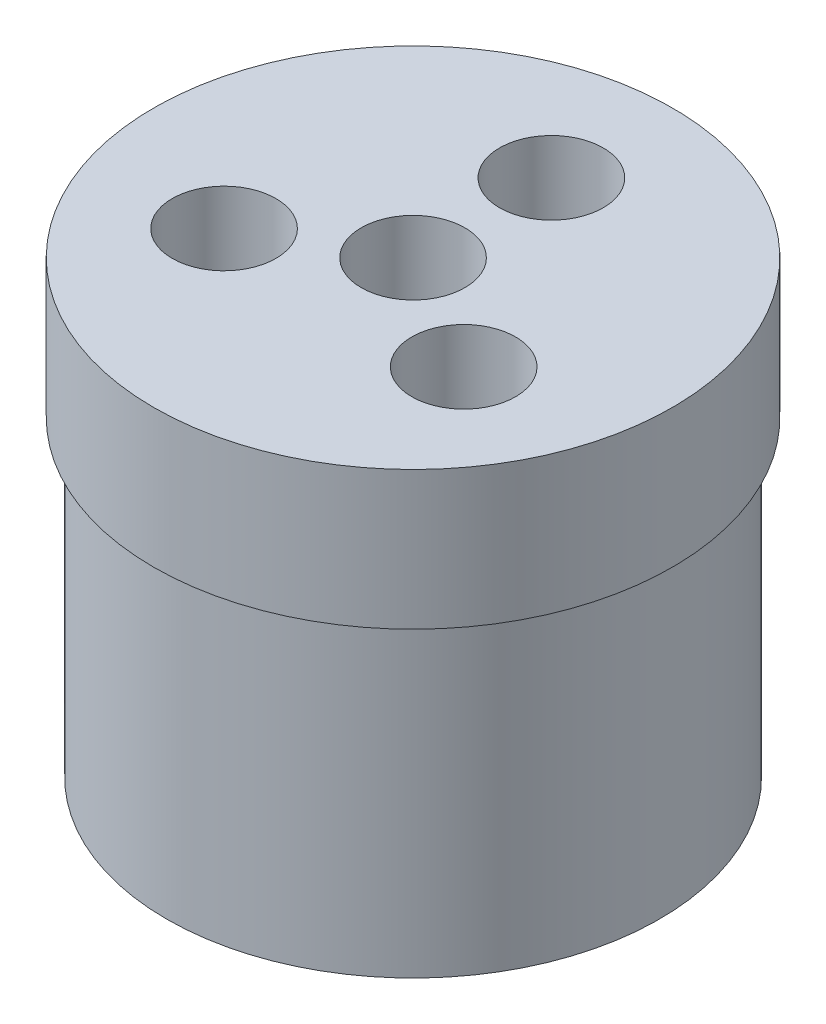
ISO-10303-21;
HEADER;
FILE_DESCRIPTION(('STEP AP214'),'2;1');
FILE_NAME('part.step','',(''),(''),'','','');
FILE_SCHEMA(('AUTOMOTIVE_DESIGN { 1 0 10303 214 1 1 1 1 }'));
ENDSEC;
DATA;
#1=APPLICATION_CONTEXT('core data for automotive mechanical design processes');
#2=APPLICATION_PROTOCOL_DEFINITION('international standard','automotive_design',2000,#1);
#3=PRODUCT_CONTEXT('',#1,'mechanical');
#4=PRODUCT('Part','Part','',(#3));
#5=PRODUCT_RELATED_PRODUCT_CATEGORY('part','',(#4));
#6=PRODUCT_DEFINITION_FORMATION('','',#4);
#7=PRODUCT_DEFINITION_CONTEXT('part definition',#1,'design');
#8=PRODUCT_DEFINITION('design','',#6,#7);
#9=PRODUCT_DEFINITION_SHAPE('','',#8);
#10=(LENGTH_UNIT() NAMED_UNIT(*) SI_UNIT(.MILLI.,.METRE.));
#11=(NAMED_UNIT(*) PLANE_ANGLE_UNIT() SI_UNIT($,.RADIAN.));
#12=(NAMED_UNIT(*) SI_UNIT($,.STERADIAN.) SOLID_ANGLE_UNIT());
#13=UNCERTAINTY_MEASURE_WITH_UNIT(LENGTH_MEASURE(1.E-05),#10,'distance_accuracy_value','');
#14=(GEOMETRIC_REPRESENTATION_CONTEXT(3) GLOBAL_UNCERTAINTY_ASSIGNED_CONTEXT((#13)) GLOBAL_UNIT_ASSIGNED_CONTEXT((#10,
#11,#12)) REPRESENTATION_CONTEXT('',''));
#15=CARTESIAN_POINT('',(0.,0.,0.));
#16=DIRECTION('',(0.,0.,1.));
#17=DIRECTION('',(1.,0.,0.));
#18=AXIS2_PLACEMENT_3D('',#15,#16,#17);
#19=CARTESIAN_POINT('',(0.,8.,0.));
#20=DIRECTION('',(0.,-1.,0.));
#21=DIRECTION('',(0.,0.,-1.));
#22=AXIS2_PLACEMENT_3D('',#19,#20,#21);
#23=CYLINDRICAL_SURFACE('',#22,15.);
#24=CARTESIAN_POINT('',(0.,8.,0.));
#25=DIRECTION('',(0.,1.,0.));
#26=DIRECTION('',(0.,0.,1.));
#27=AXIS2_PLACEMENT_3D('',#24,#25,#26);
#28=CIRCLE('',#27,15.);
#29=CARTESIAN_POINT('',(0.,8.,15.));
#30=VERTEX_POINT('',#29);
#31=EDGE_CURVE('E10',#30,#30,#28,.T.);
#32=ORIENTED_EDGE('',*,*,#31,.F.);
#33=EDGE_LOOP('',(#32));
#34=FACE_BOUND('',#33,.T.);
#35=CARTESIAN_POINT('',(0.,0.,0.));
#36=DIRECTION('',(0.,1.,0.));
#37=DIRECTION('',(0.,0.,1.));
#38=AXIS2_PLACEMENT_3D('',#35,#36,#37);
#39=CIRCLE('',#38,15.);
#40=CARTESIAN_POINT('',(0.,0.,15.));
#41=VERTEX_POINT('',#40);
#42=EDGE_CURVE('E34',#41,#41,#39,.T.);
#43=ORIENTED_EDGE('',*,*,#42,.T.);
#44=EDGE_LOOP('',(#43));
#45=FACE_BOUND('',#44,.T.);
#46=ADVANCED_FACE('F31',(#34,#45),#23,.T.);
#47=CARTESIAN_POINT('',(0.,8.,0.));
#48=DIRECTION('',(0.,1.,0.));
#49=DIRECTION('',(0.,0.,1.));
#50=AXIS2_PLACEMENT_3D('',#47,#48,#49);
#51=PLANE('',#50);
#52=CARTESIAN_POINT('',(-6.928203230275,8.,4.0000000000003));
#53=DIRECTION('',(0.,1.,0.));
#54=DIRECTION('',(0.,0.,1.));
#55=AXIS2_PLACEMENT_3D('',#52,#53,#54);
#56=CIRCLE('',#55,3.00000000000065);
#57=CARTESIAN_POINT('',(-6.928203230275,8.,7.00000000000095));
#58=VERTEX_POINT('',#57);
#59=EDGE_CURVE('E58',#58,#58,#56,.T.);
#60=ORIENTED_EDGE('',*,*,#59,.F.);
#61=EDGE_LOOP('',(#60));
#62=FACE_BOUND('',#61,.T.);
#63=CARTESIAN_POINT('',(6.92820323027602,8.,3.99999999999971));
#64=DIRECTION('',(0.,1.,0.));
#65=DIRECTION('',(0.,0.,1.));
#66=AXIS2_PLACEMENT_3D('',#63,#64,#65);
#67=CIRCLE('',#66,3.00000000000044);
#68=CARTESIAN_POINT('',(6.92820323027602,8.,7.00000000000014));
#69=VERTEX_POINT('',#68);
#70=EDGE_CURVE('E64',#69,#69,#67,.T.);
#71=ORIENTED_EDGE('',*,*,#70,.F.);
#72=EDGE_LOOP('',(#71));
#73=FACE_BOUND('',#72,.T.);
#74=CARTESIAN_POINT('',(0.,8.,-8.));
#75=DIRECTION('',(0.,1.,0.));
#76=DIRECTION('',(0.,0.,1.));
#77=AXIS2_PLACEMENT_3D('',#74,#75,#76);
#78=CIRCLE('',#77,3.);
#79=CARTESIAN_POINT('',(0.,8.,-5.));
#80=VERTEX_POINT('',#79);
#81=EDGE_CURVE('E52',#80,#80,#78,.T.);
#82=ORIENTED_EDGE('',*,*,#81,.F.);
#83=EDGE_LOOP('',(#82));
#84=FACE_BOUND('',#83,.T.);
#85=CARTESIAN_POINT('',(0.,8.,0.));
#86=DIRECTION('',(0.,1.,0.));
#87=DIRECTION('',(0.,0.,1.));
#88=AXIS2_PLACEMENT_3D('',#85,#86,#87);
#89=CIRCLE('',#88,3.);
#90=CARTESIAN_POINT('',(0.,8.,3.));
#91=VERTEX_POINT('',#90);
#92=EDGE_CURVE('E49',#91,#91,#89,.T.);
#93=ORIENTED_EDGE('',*,*,#92,.F.);
#94=EDGE_LOOP('',(#93));
#95=FACE_BOUND('',#94,.T.);
#96=ORIENTED_EDGE('',*,*,#31,.T.);
#97=EDGE_LOOP('',(#96));
#98=FACE_BOUND('',#97,.T.);
#99=ADVANCED_FACE('F75',(#62,#73,#84,#95,#98),#51,.T.);
#100=CARTESIAN_POINT('',(0.,0.,0.));
#101=DIRECTION('',(0.,1.,0.));
#102=DIRECTION('',(0.,0.,1.));
#103=AXIS2_PLACEMENT_3D('',#100,#101,#102);
#104=PLANE('',#103);
#105=CARTESIAN_POINT('',(0.,0.,0.));
#106=DIRECTION('',(0.,1.,0.));
#107=DIRECTION('',(0.,0.,1.));
#108=AXIS2_PLACEMENT_3D('',#105,#106,#107);
#109=CIRCLE('',#108,14.25);
#110=CARTESIAN_POINT('',(0.,0.,14.25));
#111=VERTEX_POINT('',#110);
#112=EDGE_CURVE('E43',#111,#111,#109,.T.);
#113=ORIENTED_EDGE('',*,*,#112,.T.);
#114=EDGE_LOOP('',(#113));
#115=FACE_BOUND('',#114,.T.);
#116=ORIENTED_EDGE('',*,*,#42,.F.);
#117=EDGE_LOOP('',(#116));
#118=FACE_BOUND('',#117,.T.);
#119=ADVANCED_FACE('F78',(#115,#118),#104,.F.);
#120=CARTESIAN_POINT('',(0.,-18.,0.));
#121=DIRECTION('',(0.,1.,0.));
#122=DIRECTION('',(0.,0.,1.));
#123=AXIS2_PLACEMENT_3D('',#120,#121,#122);
#124=CYLINDRICAL_SURFACE('',#123,14.25);
#125=CARTESIAN_POINT('',(0.,-18.,0.));
#126=DIRECTION('',(0.,1.,0.));
#127=DIRECTION('',(0.,0.,1.));
#128=AXIS2_PLACEMENT_3D('',#125,#126,#127);
#129=CIRCLE('',#128,14.25);
#130=CARTESIAN_POINT('',(0.,-18.,14.25));
#131=VERTEX_POINT('',#130);
#132=EDGE_CURVE('E41',#131,#131,#129,.T.);
#133=ORIENTED_EDGE('',*,*,#132,.T.);
#134=EDGE_LOOP('',(#133));
#135=FACE_BOUND('',#134,.T.);
#136=ORIENTED_EDGE('',*,*,#112,.F.);
#137=EDGE_LOOP('',(#136));
#138=FACE_BOUND('',#137,.T.);
#139=ADVANCED_FACE('F95',(#135,#138),#124,.T.);
#140=CARTESIAN_POINT('',(0.,-18.,0.));
#141=DIRECTION('',(0.,1.,0.));
#142=DIRECTION('',(0.,0.,1.));
#143=AXIS2_PLACEMENT_3D('',#140,#141,#142);
#144=PLANE('',#143);
#145=CARTESIAN_POINT('',(-6.928203230275,-18.,4.0000000000003));
#146=DIRECTION('',(0.,1.,0.));
#147=DIRECTION('',(0.,0.,1.));
#148=AXIS2_PLACEMENT_3D('',#145,#146,#147);
#149=CIRCLE('',#148,3.00000000000065);
#150=CARTESIAN_POINT('',(-6.928203230275,-18.,7.00000000000095));
#151=VERTEX_POINT('',#150);
#152=EDGE_CURVE('E55',#151,#151,#149,.T.);
#153=ORIENTED_EDGE('',*,*,#152,.T.);
#154=EDGE_LOOP('',(#153));
#155=FACE_BOUND('',#154,.T.);
#156=CARTESIAN_POINT('',(6.92820323027602,-18.,3.99999999999971));
#157=DIRECTION('',(0.,1.,0.));
#158=DIRECTION('',(0.,0.,1.));
#159=AXIS2_PLACEMENT_3D('',#156,#157,#158);
#160=CIRCLE('',#159,3.00000000000044);
#161=CARTESIAN_POINT('',(6.92820323027602,-18.,7.00000000000014));
#162=VERTEX_POINT('',#161);
#163=EDGE_CURVE('E61',#162,#162,#160,.T.);
#164=ORIENTED_EDGE('',*,*,#163,.T.);
#165=EDGE_LOOP('',(#164));
#166=FACE_BOUND('',#165,.T.);
#167=CARTESIAN_POINT('',(0.,-18.,-8.));
#168=DIRECTION('',(0.,1.,0.));
#169=DIRECTION('',(0.,0.,1.));
#170=AXIS2_PLACEMENT_3D('',#167,#168,#169);
#171=CIRCLE('',#170,3.);
#172=CARTESIAN_POINT('',(0.,-18.,-5.));
#173=VERTEX_POINT('',#172);
#174=EDGE_CURVE('E67',#173,#173,#171,.T.);
#175=ORIENTED_EDGE('',*,*,#174,.T.);
#176=EDGE_LOOP('',(#175));
#177=FACE_BOUND('',#176,.T.);
#178=CARTESIAN_POINT('',(0.,-18.,0.));
#179=DIRECTION('',(0.,1.,0.));
#180=DIRECTION('',(0.,0.,1.));
#181=AXIS2_PLACEMENT_3D('',#178,#179,#180);
#182=CIRCLE('',#181,3.);
#183=CARTESIAN_POINT('',(0.,-18.,3.));
#184=VERTEX_POINT('',#183);
#185=EDGE_CURVE('E46',#184,#184,#182,.T.);
#186=ORIENTED_EDGE('',*,*,#185,.T.);
#187=EDGE_LOOP('',(#186));
#188=FACE_BOUND('',#187,.T.);
#189=ORIENTED_EDGE('',*,*,#132,.F.);
#190=EDGE_LOOP('',(#189));
#191=FACE_BOUND('',#190,.T.);
#192=ADVANCED_FACE('F85',(#155,#166,#177,#188,#191),#144,.F.);
#193=CARTESIAN_POINT('',(0.,-18.,0.));
#194=DIRECTION('',(0.,1.,0.));
#195=DIRECTION('',(0.,0.,1.));
#196=AXIS2_PLACEMENT_3D('',#193,#194,#195);
#197=CYLINDRICAL_SURFACE('',#196,3.);
#198=CARTESIAN_POINT('',(0.,-18.,3.));
#199=CARTESIAN_POINT('',(0.,-17.7291666666667,3.));
#200=CARTESIAN_POINT('',(0.,-17.4583333333333,3.));
#201=CARTESIAN_POINT('',(0.,-16.9166666666667,3.));
#202=CARTESIAN_POINT('',(0.,-16.6458333333333,3.));
#203=CARTESIAN_POINT('',(0.,-16.1041666666667,3.));
#204=CARTESIAN_POINT('',(0.,-15.8333333333333,3.));
#205=CARTESIAN_POINT('',(0.,-15.2916666666667,3.));
#206=CARTESIAN_POINT('',(0.,-15.0208333333333,3.));
#207=CARTESIAN_POINT('',(0.,-14.4791666666667,3.));
#208=CARTESIAN_POINT('',(0.,-14.2083333333333,3.));
#209=CARTESIAN_POINT('',(0.,-13.6666666666667,3.));
#210=CARTESIAN_POINT('',(0.,-13.3958333333333,3.));
#211=CARTESIAN_POINT('',(0.,-12.8541666666667,3.));
#212=CARTESIAN_POINT('',(0.,-12.5833333333333,3.));
#213=CARTESIAN_POINT('',(0.,-12.0416666666667,3.));
#214=CARTESIAN_POINT('',(0.,-11.7708333333333,3.));
#215=CARTESIAN_POINT('',(0.,-11.2291666666667,3.));
#216=CARTESIAN_POINT('',(0.,-10.9583333333333,3.));
#217=CARTESIAN_POINT('',(0.,-10.4166666666667,3.));
#218=CARTESIAN_POINT('',(0.,-10.1458333333333,3.));
#219=CARTESIAN_POINT('',(0.,-9.60416666666667,3.));
#220=CARTESIAN_POINT('',(0.,-9.33333333333333,3.));
#221=CARTESIAN_POINT('',(0.,-8.79166666666667,3.));
#222=CARTESIAN_POINT('',(0.,-8.52083333333333,3.));
#223=CARTESIAN_POINT('',(0.,-7.97916666666667,3.));
#224=CARTESIAN_POINT('',(0.,-7.70833333333333,3.));
#225=CARTESIAN_POINT('',(0.,-7.16666666666667,3.));
#226=CARTESIAN_POINT('',(0.,-6.89583333333333,3.));
#227=CARTESIAN_POINT('',(0.,-6.35416666666667,3.));
#228=CARTESIAN_POINT('',(0.,-6.08333333333333,3.));
#229=CARTESIAN_POINT('',(0.,-5.54166666666667,3.));
#230=CARTESIAN_POINT('',(0.,-5.27083333333333,3.));
#231=CARTESIAN_POINT('',(0.,-4.72916666666667,3.));
#232=CARTESIAN_POINT('',(0.,-4.45833333333333,3.));
#233=CARTESIAN_POINT('',(0.,-3.91666666666667,3.));
#234=CARTESIAN_POINT('',(0.,-3.64583333333333,3.));
#235=CARTESIAN_POINT('',(0.,-3.10416666666667,3.));
#236=CARTESIAN_POINT('',(0.,-2.83333333333333,3.));
#237=CARTESIAN_POINT('',(0.,-2.29166666666667,3.));
#238=CARTESIAN_POINT('',(0.,-2.02083333333333,3.));
#239=CARTESIAN_POINT('',(0.,-1.47916666666667,3.));
#240=CARTESIAN_POINT('',(0.,-1.20833333333333,3.));
#241=CARTESIAN_POINT('',(0.,-0.666666666666667,3.));
#242=CARTESIAN_POINT('',(0.,-0.395833333333334,3.));
#243=CARTESIAN_POINT('',(0.,0.145833333333332,3.));
#244=CARTESIAN_POINT('',(0.,0.416666666666665,3.));
#245=CARTESIAN_POINT('',(0.,0.958333333333331,3.));
#246=CARTESIAN_POINT('',(0.,1.22916666666666,3.));
#247=CARTESIAN_POINT('',(0.,1.77083333333333,3.));
#248=CARTESIAN_POINT('',(0.,2.04166666666667,3.));
#249=CARTESIAN_POINT('',(0.,2.58333333333333,3.));
#250=CARTESIAN_POINT('',(0.,2.85416666666667,3.));
#251=CARTESIAN_POINT('',(0.,3.39583333333333,3.));
#252=CARTESIAN_POINT('',(0.,3.66666666666667,3.));
#253=CARTESIAN_POINT('',(0.,4.20833333333333,3.));
#254=CARTESIAN_POINT('',(0.,4.47916666666667,3.));
#255=CARTESIAN_POINT('',(0.,5.02083333333333,3.));
#256=CARTESIAN_POINT('',(0.,5.29166666666667,3.));
#257=CARTESIAN_POINT('',(0.,5.83333333333333,3.));
#258=CARTESIAN_POINT('',(0.,6.10416666666667,3.));
#259=CARTESIAN_POINT('',(0.,6.64583333333333,3.));
#260=CARTESIAN_POINT('',(0.,6.91666666666667,3.));
#261=CARTESIAN_POINT('',(0.,7.45833333333333,3.));
#262=CARTESIAN_POINT('',(0.,7.72916666666667,3.));
#263=CARTESIAN_POINT('',(0.,8.,3.));
#264=B_SPLINE_CURVE_WITH_KNOTS('',3,(#198,#199,#200,#201,#202,#203,#204,#205,#206,#207,#208,
#209,#210,#211,#212,#213,#214,#215,#216,#217,#218,#219,#220,#221,#222,#223,#224,#225,#226,#227,
#228,#229,#230,#231,#232,#233,#234,#235,#236,#237,#238,#239,#240,#241,#242,#243,#244,#245,#246,
#247,#248,#249,#250,#251,#252,#253,#254,#255,#256,#257,#258,#259,#260,#261,#262,#263),
.UNSPECIFIED.,.F.,.F.,(4,2,2,2,2,2,2,2,2,2,2,2,2,2,2,2,2,2,2,2,2,2,2,2,2,2,2,2,2,2,2,2,4),(0.,
0.812500000000001,1.625,2.4375,3.25,4.0625,4.875,5.6875,6.5,7.3125,8.125,8.9375,9.75,10.5625,
11.375,12.1875,13.,13.8125,14.625,15.4375,16.25,17.0625,17.875,18.6875,19.5,20.3125,21.125,
21.9375,22.75,23.5625,24.375,25.1875,26.),.UNSPECIFIED.);
#265=EDGE_CURVE('BSEAM83',#184,#91,#264,.T.);
#266=ORIENTED_EDGE('',*,*,#185,.F.);
#267=ORIENTED_EDGE('',*,*,#92,.T.);
#268=ORIENTED_EDGE('',*,*,#265,.T.);
#269=ORIENTED_EDGE('',*,*,#265,.F.);
#270=EDGE_LOOP('',(#266,#268,#267,#269));
#271=FACE_BOUND('',#270,.T.);
#272=ADVANCED_FACE('F83',(#271),#197,.F.);
#273=CARTESIAN_POINT('',(0.,-18.,-8.));
#274=DIRECTION('',(0.,1.,0.));
#275=DIRECTION('',(0.,0.,1.));
#276=AXIS2_PLACEMENT_3D('',#273,#274,#275);
#277=CYLINDRICAL_SURFACE('',#276,3.);
#278=CARTESIAN_POINT('',(0.,-18.,-5.));
#279=CARTESIAN_POINT('',(0.,-17.7291666666667,-5.));
#280=CARTESIAN_POINT('',(0.,-17.4583333333333,-5.));
#281=CARTESIAN_POINT('',(0.,-16.9166666666667,-5.));
#282=CARTESIAN_POINT('',(0.,-16.6458333333333,-5.));
#283=CARTESIAN_POINT('',(0.,-16.1041666666667,-5.));
#284=CARTESIAN_POINT('',(0.,-15.8333333333333,-5.));
#285=CARTESIAN_POINT('',(0.,-15.2916666666667,-5.));
#286=CARTESIAN_POINT('',(0.,-15.0208333333333,-5.));
#287=CARTESIAN_POINT('',(0.,-14.4791666666667,-5.));
#288=CARTESIAN_POINT('',(0.,-14.2083333333333,-5.));
#289=CARTESIAN_POINT('',(0.,-13.6666666666667,-5.));
#290=CARTESIAN_POINT('',(0.,-13.3958333333333,-5.));
#291=CARTESIAN_POINT('',(0.,-12.8541666666667,-5.));
#292=CARTESIAN_POINT('',(0.,-12.5833333333333,-5.));
#293=CARTESIAN_POINT('',(0.,-12.0416666666667,-5.));
#294=CARTESIAN_POINT('',(0.,-11.7708333333333,-5.));
#295=CARTESIAN_POINT('',(0.,-11.2291666666667,-5.));
#296=CARTESIAN_POINT('',(0.,-10.9583333333333,-5.));
#297=CARTESIAN_POINT('',(0.,-10.4166666666667,-5.));
#298=CARTESIAN_POINT('',(0.,-10.1458333333333,-5.));
#299=CARTESIAN_POINT('',(0.,-9.60416666666667,-5.));
#300=CARTESIAN_POINT('',(0.,-9.33333333333333,-5.));
#301=CARTESIAN_POINT('',(0.,-8.79166666666667,-5.));
#302=CARTESIAN_POINT('',(0.,-8.52083333333333,-5.));
#303=CARTESIAN_POINT('',(0.,-7.97916666666667,-5.));
#304=CARTESIAN_POINT('',(0.,-7.70833333333333,-5.));
#305=CARTESIAN_POINT('',(0.,-7.16666666666667,-5.));
#306=CARTESIAN_POINT('',(0.,-6.89583333333333,-5.));
#307=CARTESIAN_POINT('',(0.,-6.35416666666667,-5.));
#308=CARTESIAN_POINT('',(0.,-6.08333333333333,-5.));
#309=CARTESIAN_POINT('',(0.,-5.54166666666667,-5.));
#310=CARTESIAN_POINT('',(0.,-5.27083333333333,-5.));
#311=CARTESIAN_POINT('',(0.,-4.72916666666667,-5.));
#312=CARTESIAN_POINT('',(0.,-4.45833333333333,-5.));
#313=CARTESIAN_POINT('',(0.,-3.91666666666667,-5.));
#314=CARTESIAN_POINT('',(0.,-3.64583333333333,-5.));
#315=CARTESIAN_POINT('',(0.,-3.10416666666667,-5.));
#316=CARTESIAN_POINT('',(0.,-2.83333333333333,-5.));
#317=CARTESIAN_POINT('',(0.,-2.29166666666667,-5.));
#318=CARTESIAN_POINT('',(0.,-2.02083333333333,-5.));
#319=CARTESIAN_POINT('',(0.,-1.47916666666667,-5.));
#320=CARTESIAN_POINT('',(0.,-1.20833333333333,-5.));
#321=CARTESIAN_POINT('',(0.,-0.666666666666667,-5.));
#322=CARTESIAN_POINT('',(0.,-0.395833333333334,-5.));
#323=CARTESIAN_POINT('',(0.,0.145833333333332,-5.));
#324=CARTESIAN_POINT('',(0.,0.416666666666665,-5.));
#325=CARTESIAN_POINT('',(0.,0.958333333333331,-5.));
#326=CARTESIAN_POINT('',(0.,1.22916666666666,-5.));
#327=CARTESIAN_POINT('',(0.,1.77083333333333,-5.));
#328=CARTESIAN_POINT('',(0.,2.04166666666667,-5.));
#329=CARTESIAN_POINT('',(0.,2.58333333333333,-5.));
#330=CARTESIAN_POINT('',(0.,2.85416666666667,-5.));
#331=CARTESIAN_POINT('',(0.,3.39583333333333,-5.));
#332=CARTESIAN_POINT('',(0.,3.66666666666667,-5.));
#333=CARTESIAN_POINT('',(0.,4.20833333333333,-5.));
#334=CARTESIAN_POINT('',(0.,4.47916666666667,-5.));
#335=CARTESIAN_POINT('',(0.,5.02083333333333,-5.));
#336=CARTESIAN_POINT('',(0.,5.29166666666667,-5.));
#337=CARTESIAN_POINT('',(0.,5.83333333333333,-5.));
#338=CARTESIAN_POINT('',(0.,6.10416666666667,-5.));
#339=CARTESIAN_POINT('',(0.,6.64583333333333,-5.));
#340=CARTESIAN_POINT('',(0.,6.91666666666667,-5.));
#341=CARTESIAN_POINT('',(0.,7.45833333333333,-5.));
#342=CARTESIAN_POINT('',(0.,7.72916666666667,-5.));
#343=CARTESIAN_POINT('',(0.,8.,-5.));
#344=B_SPLINE_CURVE_WITH_KNOTS('',3,(#278,#279,#280,#281,#282,#283,#284,#285,#286,#287,#288,
#289,#290,#291,#292,#293,#294,#295,#296,#297,#298,#299,#300,#301,#302,#303,#304,#305,#306,#307,
#308,#309,#310,#311,#312,#313,#314,#315,#316,#317,#318,#319,#320,#321,#322,#323,#324,#325,#326,
#327,#328,#329,#330,#331,#332,#333,#334,#335,#336,#337,#338,#339,#340,#341,#342,#343),
.UNSPECIFIED.,.F.,.F.,(4,2,2,2,2,2,2,2,2,2,2,2,2,2,2,2,2,2,2,2,2,2,2,2,2,2,2,2,2,2,2,2,4),(0.,
0.812500000000001,1.625,2.4375,3.25,4.0625,4.875,5.6875,6.5,7.3125,8.125,8.9375,9.75,10.5625,
11.375,12.1875,13.,13.8125,14.625,15.4375,16.25,17.0625,17.875,18.6875,19.5,20.3125,21.125,
21.9375,22.75,23.5625,24.375,25.1875,26.),.UNSPECIFIED.);
#345=EDGE_CURVE('BSEAM73',#173,#80,#344,.T.);
#346=ORIENTED_EDGE('',*,*,#174,.F.);
#347=ORIENTED_EDGE('',*,*,#81,.T.);
#348=ORIENTED_EDGE('',*,*,#345,.T.);
#349=ORIENTED_EDGE('',*,*,#345,.F.);
#350=EDGE_LOOP('',(#346,#348,#347,#349));
#351=FACE_BOUND('',#350,.T.);
#352=ADVANCED_FACE('F73',(#351),#277,.F.);
#353=CARTESIAN_POINT('',(6.92820323027602,-18.,3.99999999999971));
#354=DIRECTION('',(0.,1.,0.));
#355=DIRECTION('',(0.,0.,1.));
#356=AXIS2_PLACEMENT_3D('',#353,#354,#355);
#357=CYLINDRICAL_SURFACE('',#356,3.00000000000044);
#358=CARTESIAN_POINT('',(6.92820323027602,-18.,7.00000000000014));
#359=CARTESIAN_POINT('',(6.92820323027602,-17.7291666666667,7.00000000000014));
#360=CARTESIAN_POINT('',(6.92820323027602,-17.4583333333333,7.00000000000014));
#361=CARTESIAN_POINT('',(6.92820323027602,-16.9166666666667,7.00000000000014));
#362=CARTESIAN_POINT('',(6.92820323027602,-16.6458333333333,7.00000000000014));
#363=CARTESIAN_POINT('',(6.92820323027602,-16.1041666666667,7.00000000000014));
#364=CARTESIAN_POINT('',(6.92820323027602,-15.8333333333333,7.00000000000014));
#365=CARTESIAN_POINT('',(6.92820323027602,-15.2916666666667,7.00000000000014));
#366=CARTESIAN_POINT('',(6.92820323027602,-15.0208333333333,7.00000000000014));
#367=CARTESIAN_POINT('',(6.92820323027602,-14.4791666666667,7.00000000000014));
#368=CARTESIAN_POINT('',(6.92820323027602,-14.2083333333333,7.00000000000014));
#369=CARTESIAN_POINT('',(6.92820323027602,-13.6666666666667,7.00000000000014));
#370=CARTESIAN_POINT('',(6.92820323027602,-13.3958333333333,7.00000000000014));
#371=CARTESIAN_POINT('',(6.92820323027602,-12.8541666666667,7.00000000000014));
#372=CARTESIAN_POINT('',(6.92820323027602,-12.5833333333333,7.00000000000014));
#373=CARTESIAN_POINT('',(6.92820323027602,-12.0416666666667,7.00000000000014));
#374=CARTESIAN_POINT('',(6.92820323027602,-11.7708333333333,7.00000000000014));
#375=CARTESIAN_POINT('',(6.92820323027602,-11.2291666666667,7.00000000000014));
#376=CARTESIAN_POINT('',(6.92820323027602,-10.9583333333333,7.00000000000014));
#377=CARTESIAN_POINT('',(6.92820323027602,-10.4166666666667,7.00000000000014));
#378=CARTESIAN_POINT('',(6.92820323027602,-10.1458333333333,7.00000000000014));
#379=CARTESIAN_POINT('',(6.92820323027602,-9.60416666666667,7.00000000000014));
#380=CARTESIAN_POINT('',(6.92820323027602,-9.33333333333333,7.00000000000014));
#381=CARTESIAN_POINT('',(6.92820323027602,-8.79166666666667,7.00000000000014));
#382=CARTESIAN_POINT('',(6.92820323027602,-8.52083333333333,7.00000000000014));
#383=CARTESIAN_POINT('',(6.92820323027602,-7.97916666666667,7.00000000000014));
#384=CARTESIAN_POINT('',(6.92820323027602,-7.70833333333333,7.00000000000014));
#385=CARTESIAN_POINT('',(6.92820323027602,-7.16666666666667,7.00000000000014));
#386=CARTESIAN_POINT('',(6.92820323027602,-6.89583333333333,7.00000000000014));
#387=CARTESIAN_POINT('',(6.92820323027602,-6.35416666666667,7.00000000000014));
#388=CARTESIAN_POINT('',(6.92820323027602,-6.08333333333333,7.00000000000014));
#389=CARTESIAN_POINT('',(6.92820323027602,-5.54166666666667,7.00000000000014));
#390=CARTESIAN_POINT('',(6.92820323027602,-5.27083333333333,7.00000000000014));
#391=CARTESIAN_POINT('',(6.92820323027602,-4.72916666666667,7.00000000000014));
#392=CARTESIAN_POINT('',(6.92820323027602,-4.45833333333333,7.00000000000014));
#393=CARTESIAN_POINT('',(6.92820323027602,-3.91666666666667,7.00000000000014));
#394=CARTESIAN_POINT('',(6.92820323027602,-3.64583333333333,7.00000000000014));
#395=CARTESIAN_POINT('',(6.92820323027602,-3.10416666666667,7.00000000000014));
#396=CARTESIAN_POINT('',(6.92820323027602,-2.83333333333333,7.00000000000014));
#397=CARTESIAN_POINT('',(6.92820323027602,-2.29166666666667,7.00000000000014));
#398=CARTESIAN_POINT('',(6.92820323027602,-2.02083333333333,7.00000000000014));
#399=CARTESIAN_POINT('',(6.92820323027602,-1.47916666666667,7.00000000000014));
#400=CARTESIAN_POINT('',(6.92820323027602,-1.20833333333333,7.00000000000014));
#401=CARTESIAN_POINT('',(6.92820323027602,-0.666666666666667,7.00000000000014));
#402=CARTESIAN_POINT('',(6.92820323027602,-0.395833333333334,7.00000000000014));
#403=CARTESIAN_POINT('',(6.92820323027602,0.145833333333332,7.00000000000014));
#404=CARTESIAN_POINT('',(6.92820323027602,0.416666666666665,7.00000000000014));
#405=CARTESIAN_POINT('',(6.92820323027602,0.958333333333331,7.00000000000014));
#406=CARTESIAN_POINT('',(6.92820323027602,1.22916666666666,7.00000000000014));
#407=CARTESIAN_POINT('',(6.92820323027602,1.77083333333333,7.00000000000014));
#408=CARTESIAN_POINT('',(6.92820323027602,2.04166666666667,7.00000000000014));
#409=CARTESIAN_POINT('',(6.92820323027602,2.58333333333333,7.00000000000014));
#410=CARTESIAN_POINT('',(6.92820323027602,2.85416666666667,7.00000000000014));
#411=CARTESIAN_POINT('',(6.92820323027602,3.39583333333333,7.00000000000014));
#412=CARTESIAN_POINT('',(6.92820323027602,3.66666666666667,7.00000000000014));
#413=CARTESIAN_POINT('',(6.92820323027602,4.20833333333333,7.00000000000014));
#414=CARTESIAN_POINT('',(6.92820323027602,4.47916666666667,7.00000000000014));
#415=CARTESIAN_POINT('',(6.92820323027602,5.02083333333333,7.00000000000014));
#416=CARTESIAN_POINT('',(6.92820323027602,5.29166666666667,7.00000000000014));
#417=CARTESIAN_POINT('',(6.92820323027602,5.83333333333333,7.00000000000014));
#418=CARTESIAN_POINT('',(6.92820323027602,6.10416666666667,7.00000000000014));
#419=CARTESIAN_POINT('',(6.92820323027602,6.64583333333333,7.00000000000014));
#420=CARTESIAN_POINT('',(6.92820323027602,6.91666666666667,7.00000000000014));
#421=CARTESIAN_POINT('',(6.92820323027602,7.45833333333333,7.00000000000014));
#422=CARTESIAN_POINT('',(6.92820323027602,7.72916666666667,7.00000000000014));
#423=CARTESIAN_POINT('',(6.92820323027602,8.,7.00000000000014));
#424=B_SPLINE_CURVE_WITH_KNOTS('',3,(#358,#359,#360,#361,#362,#363,#364,#365,#366,#367,#368,
#369,#370,#371,#372,#373,#374,#375,#376,#377,#378,#379,#380,#381,#382,#383,#384,#385,#386,#387,
#388,#389,#390,#391,#392,#393,#394,#395,#396,#397,#398,#399,#400,#401,#402,#403,#404,#405,#406,
#407,#408,#409,#410,#411,#412,#413,#414,#415,#416,#417,#418,#419,#420,#421,#422,#423),
.UNSPECIFIED.,.F.,.F.,(4,2,2,2,2,2,2,2,2,2,2,2,2,2,2,2,2,2,2,2,2,2,2,2,2,2,2,2,2,2,2,2,4),(0.,
0.812500000000001,1.625,2.4375,3.25,4.0625,4.875,5.6875,6.5,7.3125,8.125,8.9375,9.75,10.5625,
11.375,12.1875,13.,13.8125,14.625,15.4375,16.25,17.0625,17.875,18.6875,19.5,20.3125,21.125,
21.9375,22.75,23.5625,24.375,25.1875,26.),.UNSPECIFIED.);
#425=EDGE_CURVE('BSEAM92',#162,#69,#424,.T.);
#426=ORIENTED_EDGE('',*,*,#163,.F.);
#427=ORIENTED_EDGE('',*,*,#70,.T.);
#428=ORIENTED_EDGE('',*,*,#425,.T.);
#429=ORIENTED_EDGE('',*,*,#425,.F.);
#430=EDGE_LOOP('',(#426,#428,#427,#429));
#431=FACE_BOUND('',#430,.T.);
#432=ADVANCED_FACE('F92',(#431),#357,.F.);
#433=CARTESIAN_POINT('',(-6.928203230275,-18.,4.0000000000003));
#434=DIRECTION('',(0.,1.,0.));
#435=DIRECTION('',(0.,0.,1.));
#436=AXIS2_PLACEMENT_3D('',#433,#434,#435);
#437=CYLINDRICAL_SURFACE('',#436,3.00000000000065);
#438=CARTESIAN_POINT('',(-6.928203230275,-18.,7.00000000000095));
#439=CARTESIAN_POINT('',(-6.928203230275,-17.7291666666667,7.00000000000095));
#440=CARTESIAN_POINT('',(-6.928203230275,-17.4583333333333,7.00000000000095));
#441=CARTESIAN_POINT('',(-6.928203230275,-16.9166666666667,7.00000000000095));
#442=CARTESIAN_POINT('',(-6.928203230275,-16.6458333333333,7.00000000000095));
#443=CARTESIAN_POINT('',(-6.928203230275,-16.1041666666667,7.00000000000095));
#444=CARTESIAN_POINT('',(-6.928203230275,-15.8333333333333,7.00000000000095));
#445=CARTESIAN_POINT('',(-6.928203230275,-15.2916666666667,7.00000000000095));
#446=CARTESIAN_POINT('',(-6.928203230275,-15.0208333333333,7.00000000000095));
#447=CARTESIAN_POINT('',(-6.928203230275,-14.4791666666667,7.00000000000095));
#448=CARTESIAN_POINT('',(-6.928203230275,-14.2083333333333,7.00000000000095));
#449=CARTESIAN_POINT('',(-6.928203230275,-13.6666666666667,7.00000000000095));
#450=CARTESIAN_POINT('',(-6.928203230275,-13.3958333333333,7.00000000000095));
#451=CARTESIAN_POINT('',(-6.928203230275,-12.8541666666667,7.00000000000095));
#452=CARTESIAN_POINT('',(-6.928203230275,-12.5833333333333,7.00000000000095));
#453=CARTESIAN_POINT('',(-6.928203230275,-12.0416666666667,7.00000000000095));
#454=CARTESIAN_POINT('',(-6.928203230275,-11.7708333333333,7.00000000000095));
#455=CARTESIAN_POINT('',(-6.928203230275,-11.2291666666667,7.00000000000095));
#456=CARTESIAN_POINT('',(-6.928203230275,-10.9583333333333,7.00000000000095));
#457=CARTESIAN_POINT('',(-6.928203230275,-10.4166666666667,7.00000000000095));
#458=CARTESIAN_POINT('',(-6.928203230275,-10.1458333333333,7.00000000000095));
#459=CARTESIAN_POINT('',(-6.928203230275,-9.60416666666667,7.00000000000095));
#460=CARTESIAN_POINT('',(-6.928203230275,-9.33333333333333,7.00000000000095));
#461=CARTESIAN_POINT('',(-6.928203230275,-8.79166666666667,7.00000000000095));
#462=CARTESIAN_POINT('',(-6.928203230275,-8.52083333333333,7.00000000000095));
#463=CARTESIAN_POINT('',(-6.928203230275,-7.97916666666667,7.00000000000095));
#464=CARTESIAN_POINT('',(-6.928203230275,-7.70833333333333,7.00000000000095));
#465=CARTESIAN_POINT('',(-6.928203230275,-7.16666666666667,7.00000000000095));
#466=CARTESIAN_POINT('',(-6.928203230275,-6.89583333333333,7.00000000000095));
#467=CARTESIAN_POINT('',(-6.928203230275,-6.35416666666667,7.00000000000095));
#468=CARTESIAN_POINT('',(-6.928203230275,-6.08333333333333,7.00000000000095));
#469=CARTESIAN_POINT('',(-6.928203230275,-5.54166666666667,7.00000000000095));
#470=CARTESIAN_POINT('',(-6.928203230275,-5.27083333333333,7.00000000000095));
#471=CARTESIAN_POINT('',(-6.928203230275,-4.72916666666667,7.00000000000095));
#472=CARTESIAN_POINT('',(-6.928203230275,-4.45833333333333,7.00000000000095));
#473=CARTESIAN_POINT('',(-6.928203230275,-3.91666666666667,7.00000000000095));
#474=CARTESIAN_POINT('',(-6.928203230275,-3.64583333333333,7.00000000000095));
#475=CARTESIAN_POINT('',(-6.928203230275,-3.10416666666667,7.00000000000095));
#476=CARTESIAN_POINT('',(-6.928203230275,-2.83333333333333,7.00000000000095));
#477=CARTESIAN_POINT('',(-6.928203230275,-2.29166666666667,7.00000000000095));
#478=CARTESIAN_POINT('',(-6.928203230275,-2.02083333333333,7.00000000000095));
#479=CARTESIAN_POINT('',(-6.928203230275,-1.47916666666667,7.00000000000095));
#480=CARTESIAN_POINT('',(-6.928203230275,-1.20833333333333,7.00000000000095));
#481=CARTESIAN_POINT('',(-6.928203230275,-0.666666666666667,7.00000000000095));
#482=CARTESIAN_POINT('',(-6.928203230275,-0.395833333333334,7.00000000000095));
#483=CARTESIAN_POINT('',(-6.928203230275,0.145833333333332,7.00000000000095));
#484=CARTESIAN_POINT('',(-6.928203230275,0.416666666666665,7.00000000000095));
#485=CARTESIAN_POINT('',(-6.928203230275,0.958333333333331,7.00000000000095));
#486=CARTESIAN_POINT('',(-6.928203230275,1.22916666666666,7.00000000000095));
#487=CARTESIAN_POINT('',(-6.928203230275,1.77083333333333,7.00000000000095));
#488=CARTESIAN_POINT('',(-6.928203230275,2.04166666666667,7.00000000000095));
#489=CARTESIAN_POINT('',(-6.928203230275,2.58333333333333,7.00000000000095));
#490=CARTESIAN_POINT('',(-6.928203230275,2.85416666666667,7.00000000000095));
#491=CARTESIAN_POINT('',(-6.928203230275,3.39583333333333,7.00000000000095));
#492=CARTESIAN_POINT('',(-6.928203230275,3.66666666666667,7.00000000000095));
#493=CARTESIAN_POINT('',(-6.928203230275,4.20833333333333,7.00000000000095));
#494=CARTESIAN_POINT('',(-6.928203230275,4.47916666666667,7.00000000000095));
#495=CARTESIAN_POINT('',(-6.928203230275,5.02083333333333,7.00000000000095));
#496=CARTESIAN_POINT('',(-6.928203230275,5.29166666666667,7.00000000000095));
#497=CARTESIAN_POINT('',(-6.928203230275,5.83333333333333,7.00000000000095));
#498=CARTESIAN_POINT('',(-6.928203230275,6.10416666666667,7.00000000000095));
#499=CARTESIAN_POINT('',(-6.928203230275,6.64583333333333,7.00000000000095));
#500=CARTESIAN_POINT('',(-6.928203230275,6.91666666666667,7.00000000000095));
#501=CARTESIAN_POINT('',(-6.928203230275,7.45833333333333,7.00000000000095));
#502=CARTESIAN_POINT('',(-6.928203230275,7.72916666666667,7.00000000000095));
#503=CARTESIAN_POINT('',(-6.928203230275,8.,7.00000000000095));
#504=B_SPLINE_CURVE_WITH_KNOTS('',3,(#438,#439,#440,#441,#442,#443,#444,#445,#446,#447,#448,
#449,#450,#451,#452,#453,#454,#455,#456,#457,#458,#459,#460,#461,#462,#463,#464,#465,#466,#467,
#468,#469,#470,#471,#472,#473,#474,#475,#476,#477,#478,#479,#480,#481,#482,#483,#484,#485,#486,
#487,#488,#489,#490,#491,#492,#493,#494,#495,#496,#497,#498,#499,#500,#501,#502,#503),
.UNSPECIFIED.,.F.,.F.,(4,2,2,2,2,2,2,2,2,2,2,2,2,2,2,2,2,2,2,2,2,2,2,2,2,2,2,2,2,2,2,2,4),(0.,
0.812500000000001,1.625,2.4375,3.25,4.0625,4.875,5.6875,6.5,7.3125,8.125,8.9375,9.75,10.5625,
11.375,12.1875,13.,13.8125,14.625,15.4375,16.25,17.0625,17.875,18.6875,19.5,20.3125,21.125,
21.9375,22.75,23.5625,24.375,25.1875,26.),.UNSPECIFIED.);
#505=EDGE_CURVE('BSEAM146',#151,#58,#504,.T.);
#506=ORIENTED_EDGE('',*,*,#152,.F.);
#507=ORIENTED_EDGE('',*,*,#59,.T.);
#508=ORIENTED_EDGE('',*,*,#505,.T.);
#509=ORIENTED_EDGE('',*,*,#505,.F.);
#510=EDGE_LOOP('',(#506,#508,#507,#509));
#511=FACE_BOUND('',#510,.T.);
#512=ADVANCED_FACE('F146',(#511),#437,.F.);
#513=CLOSED_SHELL('',(#46,#99,#119,#139,#192,#272,#352,#432,#512));
#514=MANIFOLD_SOLID_BREP('B2',#513);
#515=ADVANCED_BREP_SHAPE_REPRESENTATION('',(#18,#514),#14);
#516=SHAPE_DEFINITION_REPRESENTATION(#9,#515);
ENDSEC;
END-ISO-10303-21;
